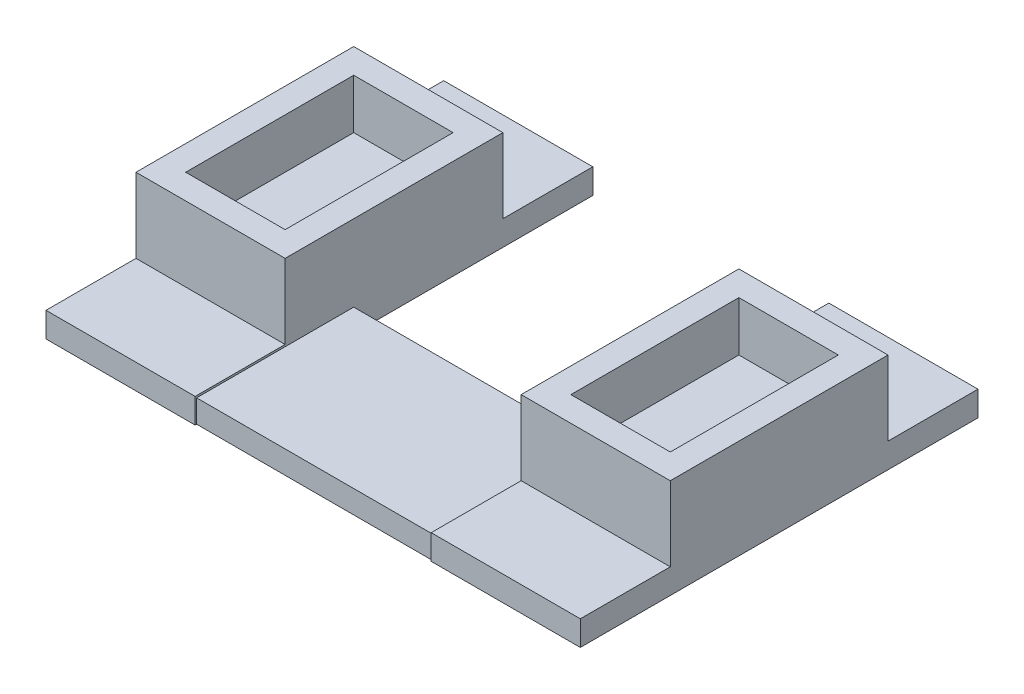
ISO-10303-21;
HEADER;
FILE_DESCRIPTION(('STEP AP214'),'2;1');
FILE_NAME('part.step','',(''),(''),'','','');
FILE_SCHEMA(('AUTOMOTIVE_DESIGN { 1 0 10303 214 1 1 1 1 }'));
ENDSEC;
DATA;
#1=APPLICATION_CONTEXT('core data for automotive mechanical design processes');
#2=APPLICATION_PROTOCOL_DEFINITION('international standard','automotive_design',2000,#1);
#3=PRODUCT_CONTEXT('',#1,'mechanical');
#4=PRODUCT('Part','Part','',(#3));
#5=PRODUCT_RELATED_PRODUCT_CATEGORY('part','',(#4));
#6=PRODUCT_DEFINITION_FORMATION('','',#4);
#7=PRODUCT_DEFINITION_CONTEXT('part definition',#1,'design');
#8=PRODUCT_DEFINITION('design','',#6,#7);
#9=PRODUCT_DEFINITION_SHAPE('','',#8);
#10=(LENGTH_UNIT() NAMED_UNIT(*) SI_UNIT(.MILLI.,.METRE.));
#11=(NAMED_UNIT(*) PLANE_ANGLE_UNIT() SI_UNIT($,.RADIAN.));
#12=(NAMED_UNIT(*) SI_UNIT($,.STERADIAN.) SOLID_ANGLE_UNIT());
#13=UNCERTAINTY_MEASURE_WITH_UNIT(LENGTH_MEASURE(1.E-05),#10,'distance_accuracy_value','');
#14=(GEOMETRIC_REPRESENTATION_CONTEXT(3) GLOBAL_UNCERTAINTY_ASSIGNED_CONTEXT((#13)) GLOBAL_UNIT_ASSIGNED_CONTEXT((#10,
#11,#12)) REPRESENTATION_CONTEXT('',''));
#15=CARTESIAN_POINT('',(0.,0.,0.));
#16=DIRECTION('',(0.,0.,1.));
#17=DIRECTION('',(1.,0.,0.));
#18=AXIS2_PLACEMENT_3D('',#15,#16,#17);
#19=CARTESIAN_POINT('',(15.0749,6.35,-13.9065));
#20=DIRECTION('',(1.,0.,0.));
#21=DIRECTION('',(0.,0.,-1.));
#22=AXIS2_PLACEMENT_3D('',#19,#20,#21);
#23=PLANE('',#22);
#24=DIRECTION('',(0.,0.,-1.));
#25=VECTOR('',#24,1.);
#26=CARTESIAN_POINT('',(15.0749,-3.42900000000001,13.9065));
#27=LINE('',#26,#25);
#28=CARTESIAN_POINT('',(15.0749,-3.42900000000001,25.2095));
#29=VERTEX_POINT('',#28);
#30=CARTESIAN_POINT('',(15.0749,-3.42900000000001,5.1435));
#31=VERTEX_POINT('',#30);
#32=EDGE_CURVE('E231',#29,#31,#27,.T.);
#33=ORIENTED_EDGE('',*,*,#32,.F.);
#34=DIRECTION('',(0.,1.,0.));
#35=VECTOR('',#34,1.);
#36=CARTESIAN_POINT('',(15.0749,-6.35,25.2095));
#37=LINE('',#36,#35);
#38=CARTESIAN_POINT('',(15.0749,-6.35,25.2095));
#39=VERTEX_POINT('',#38);
#40=EDGE_CURVE('E245',#39,#29,#37,.T.);
#41=ORIENTED_EDGE('',*,*,#40,.F.);
#42=DIRECTION('',(0.,0.,-1.));
#43=VECTOR('',#42,1.);
#44=CARTESIAN_POINT('',(15.0749,-6.35,13.9065));
#45=LINE('',#44,#43);
#46=CARTESIAN_POINT('',(15.0749,-6.35,25.4));
#47=VERTEX_POINT('',#46);
#48=EDGE_CURVE('E278',#47,#39,#45,.T.);
#49=ORIENTED_EDGE('',*,*,#48,.F.);
#50=DIRECTION('',(0.,1.,0.));
#51=VECTOR('',#50,1.);
#52=CARTESIAN_POINT('',(15.0749,-6.35,25.4));
#53=LINE('',#52,#51);
#54=CARTESIAN_POINT('',(15.0749,-3.175,25.4));
#55=VERTEX_POINT('',#54);
#56=EDGE_CURVE('E316',#47,#55,#53,.T.);
#57=ORIENTED_EDGE('',*,*,#56,.T.);
#58=DIRECTION('',(0.,0.,-1.));
#59=VECTOR('',#58,1.);
#60=CARTESIAN_POINT('',(15.0749,-3.175,13.9065));
#61=LINE('',#60,#59);
#62=CARTESIAN_POINT('',(15.0749,-3.175,13.9065));
#63=VERTEX_POINT('',#62);
#64=EDGE_CURVE('E303',#55,#63,#61,.T.);
#65=ORIENTED_EDGE('',*,*,#64,.T.);
#66=DIRECTION('',(0.,1.,0.));
#67=VECTOR('',#66,1.);
#68=CARTESIAN_POINT('',(15.0749,-3.42900000000001,13.9065));
#69=LINE('',#68,#67);
#70=CARTESIAN_POINT('',(15.0749,6.35,13.9065));
#71=VERTEX_POINT('',#70);
#72=EDGE_CURVE('E53',#63,#71,#69,.T.);
#73=ORIENTED_EDGE('',*,*,#72,.T.);
#74=DIRECTION('',(0.,0.,1.));
#75=VECTOR('',#74,1.);
#76=CARTESIAN_POINT('',(15.0749,6.35,-13.9065));
#77=LINE('',#76,#75);
#78=CARTESIAN_POINT('',(15.0749,6.35,-13.9065));
#79=VERTEX_POINT('',#78);
#80=EDGE_CURVE('E410',#79,#71,#77,.T.);
#81=ORIENTED_EDGE('',*,*,#80,.F.);
#82=DIRECTION('',(0.,-1.,0.));
#83=VECTOR('',#82,1.);
#84=CARTESIAN_POINT('',(15.0749,6.35,-13.9065));
#85=LINE('',#84,#83);
#86=CARTESIAN_POINT('',(15.0749,-3.175,-13.9065));
#87=VERTEX_POINT('',#86);
#88=EDGE_CURVE('E11',#79,#87,#85,.T.);
#89=ORIENTED_EDGE('',*,*,#88,.T.);
#90=DIRECTION('',(0.,0.,-1.));
#91=VECTOR('',#90,1.);
#92=CARTESIAN_POINT('',(15.0749,-3.175,-25.4));
#93=LINE('',#92,#91);
#94=CARTESIAN_POINT('',(15.0749,-3.175,-25.4));
#95=VERTEX_POINT('',#94);
#96=EDGE_CURVE('E293',#87,#95,#93,.T.);
#97=ORIENTED_EDGE('',*,*,#96,.T.);
#98=DIRECTION('',(0.,1.,0.));
#99=VECTOR('',#98,1.);
#100=CARTESIAN_POINT('',(15.0749,-6.35,-25.4));
#101=LINE('',#100,#99);
#102=CARTESIAN_POINT('',(15.0749,-6.35,-25.4));
#103=VERTEX_POINT('',#102);
#104=EDGE_CURVE('E324',#103,#95,#101,.T.);
#105=ORIENTED_EDGE('',*,*,#104,.F.);
#106=DIRECTION('',(0.,0.,-1.));
#107=VECTOR('',#106,1.);
#108=CARTESIAN_POINT('',(15.0749,-6.35,-25.4));
#109=LINE('',#108,#107);
#110=CARTESIAN_POINT('',(15.0749,-6.35,5.1435));
#111=VERTEX_POINT('',#110);
#112=EDGE_CURVE('E275',#111,#103,#109,.T.);
#113=ORIENTED_EDGE('',*,*,#112,.F.);
#114=DIRECTION('',(0.,-1.,0.));
#115=VECTOR('',#114,1.);
#116=CARTESIAN_POINT('',(15.0749,6.35,5.1435));
#117=LINE('',#116,#115);
#118=EDGE_CURVE('E50',#31,#111,#117,.T.);
#119=ORIENTED_EDGE('',*,*,#118,.F.);
#120=EDGE_LOOP('',(#33,#41,#49,#57,#65,#73,#81,#89,#97,#105,#113,#119));
#121=FACE_BOUND('',#120,.T.);
#122=ADVANCED_FACE('F39',(#121),#23,.F.);
#123=CARTESIAN_POINT('',(-15.0749,6.35,-13.9065));
#124=DIRECTION('',(-1.,0.,0.));
#125=DIRECTION('',(0.,0.,1.));
#126=AXIS2_PLACEMENT_3D('',#123,#124,#125);
#127=PLANE('',#126);
#128=DIRECTION('',(0.,-1.,0.));
#129=VECTOR('',#128,1.);
#130=CARTESIAN_POINT('',(-15.0749,-3.42900000000001,25.2095));
#131=LINE('',#130,#129);
#132=CARTESIAN_POINT('',(-15.0749,-3.42900000000001,25.2095));
#133=VERTEX_POINT('',#132);
#134=CARTESIAN_POINT('',(-15.0749,-6.35,25.2095));
#135=VERTEX_POINT('',#134);
#136=EDGE_CURVE('E239',#133,#135,#131,.T.);
#137=ORIENTED_EDGE('',*,*,#136,.F.);
#138=DIRECTION('',(0.,0.,1.));
#139=VECTOR('',#138,1.);
#140=CARTESIAN_POINT('',(-15.0749,-3.42900000000001,5.1435));
#141=LINE('',#140,#139);
#142=CARTESIAN_POINT('',(-15.0749,-3.42900000000001,5.1435));
#143=VERTEX_POINT('',#142);
#144=EDGE_CURVE('E223',#143,#133,#141,.T.);
#145=ORIENTED_EDGE('',*,*,#144,.F.);
#146=DIRECTION('',(0.,-1.,0.));
#147=VECTOR('',#146,1.);
#148=CARTESIAN_POINT('',(-15.0749,6.35,5.1435));
#149=LINE('',#148,#147);
#150=CARTESIAN_POINT('',(-15.0749,-6.35,5.1435));
#151=VERTEX_POINT('',#150);
#152=EDGE_CURVE('E431',#143,#151,#149,.T.);
#153=ORIENTED_EDGE('',*,*,#152,.T.);
#154=DIRECTION('',(0.,0.,1.));
#155=VECTOR('',#154,1.);
#156=CARTESIAN_POINT('',(-15.0749,-6.35,-25.4));
#157=LINE('',#156,#155);
#158=CARTESIAN_POINT('',(-15.0749,-6.35,-25.4));
#159=VERTEX_POINT('',#158);
#160=EDGE_CURVE('E266',#159,#151,#157,.T.);
#161=ORIENTED_EDGE('',*,*,#160,.F.);
#162=DIRECTION('',(0.,1.,0.));
#163=VECTOR('',#162,1.);
#164=CARTESIAN_POINT('',(-15.0749,-6.35,-25.4));
#165=LINE('',#164,#163);
#166=CARTESIAN_POINT('',(-15.0749,-3.175,-25.4));
#167=VERTEX_POINT('',#166);
#168=EDGE_CURVE('E327',#159,#167,#165,.T.);
#169=ORIENTED_EDGE('',*,*,#168,.T.);
#170=DIRECTION('',(0.,0.,1.));
#171=VECTOR('',#170,1.);
#172=CARTESIAN_POINT('',(-15.0749,-3.175,-25.4));
#173=LINE('',#172,#171);
#174=CARTESIAN_POINT('',(-15.0749,-3.175,-13.9065));
#175=VERTEX_POINT('',#174);
#176=EDGE_CURVE('E295',#167,#175,#173,.T.);
#177=ORIENTED_EDGE('',*,*,#176,.T.);
#178=DIRECTION('',(0.,-1.,0.));
#179=VECTOR('',#178,1.);
#180=CARTESIAN_POINT('',(-15.0749,6.35,-13.9065));
#181=LINE('',#180,#179);
#182=CARTESIAN_POINT('',(-15.0749,6.35,-13.9065));
#183=VERTEX_POINT('',#182);
#184=EDGE_CURVE('E427',#183,#175,#181,.T.);
#185=ORIENTED_EDGE('',*,*,#184,.F.);
#186=DIRECTION('',(0.,0.,-1.));
#187=VECTOR('',#186,1.);
#188=CARTESIAN_POINT('',(-15.0749,6.35,-13.9065));
#189=LINE('',#188,#187);
#190=CARTESIAN_POINT('',(-15.0749,6.35,13.9065));
#191=VERTEX_POINT('',#190);
#192=EDGE_CURVE('E406',#191,#183,#189,.T.);
#193=ORIENTED_EDGE('',*,*,#192,.F.);
#194=DIRECTION('',(0.,1.,0.));
#195=VECTOR('',#194,1.);
#196=CARTESIAN_POINT('',(-15.0749,-3.42900000000001,13.9065));
#197=LINE('',#196,#195);
#198=CARTESIAN_POINT('',(-15.0749,-3.175,13.9065));
#199=VERTEX_POINT('',#198);
#200=EDGE_CURVE('E254',#199,#191,#197,.T.);
#201=ORIENTED_EDGE('',*,*,#200,.F.);
#202=DIRECTION('',(0.,0.,1.));
#203=VECTOR('',#202,1.);
#204=CARTESIAN_POINT('',(-15.0749,-3.175,13.9065));
#205=LINE('',#204,#203);
#206=CARTESIAN_POINT('',(-15.0749,-3.175,25.4));
#207=VERTEX_POINT('',#206);
#208=EDGE_CURVE('E306',#199,#207,#205,.T.);
#209=ORIENTED_EDGE('',*,*,#208,.T.);
#210=DIRECTION('',(0.,1.,0.));
#211=VECTOR('',#210,1.);
#212=CARTESIAN_POINT('',(-15.0749,-6.35,25.4));
#213=LINE('',#212,#211);
#214=CARTESIAN_POINT('',(-15.0749,-6.35,25.4));
#215=VERTEX_POINT('',#214);
#216=EDGE_CURVE('E311',#215,#207,#213,.T.);
#217=ORIENTED_EDGE('',*,*,#216,.F.);
#218=DIRECTION('',(0.,0.,1.));
#219=VECTOR('',#218,1.);
#220=CARTESIAN_POINT('',(-15.0749,-6.35,13.9065));
#221=LINE('',#220,#219);
#222=EDGE_CURVE('E249',#135,#215,#221,.T.);
#223=ORIENTED_EDGE('',*,*,#222,.F.);
#224=EDGE_LOOP('',(#137,#145,#153,#161,#169,#177,#185,#193,#201,#209,#217,#223));
#225=FACE_BOUND('',#224,.T.);
#226=ADVANCED_FACE('F243',(#225),#127,.F.);
#227=CARTESIAN_POINT('',(0.,6.35,0.));
#228=DIRECTION('',(0.,-1.,0.));
#229=DIRECTION('',(0.,0.,-1.));
#230=AXIS2_PLACEMENT_3D('',#227,#228,#229);
#231=PLANE('',#230);
#232=DIRECTION('',(0.,0.,-1.));
#233=VECTOR('',#232,1.);
#234=CARTESIAN_POINT('',(-18.2499,6.35,-10.7315));
#235=LINE('',#234,#233);
#236=CARTESIAN_POINT('',(-18.2499,6.35,10.7315));
#237=VERTEX_POINT('',#236);
#238=CARTESIAN_POINT('',(-18.2499,6.35,-10.7315));
#239=VERTEX_POINT('',#238);
#240=EDGE_CURVE('E373',#237,#239,#235,.T.);
#241=ORIENTED_EDGE('',*,*,#240,.F.);
#242=DIRECTION('',(1.,0.,0.));
#243=VECTOR('',#242,1.);
#244=CARTESIAN_POINT('',(-30.9499,6.35,10.7315));
#245=LINE('',#244,#243);
#246=CARTESIAN_POINT('',(-30.9499,6.35,10.7315));
#247=VERTEX_POINT('',#246);
#248=EDGE_CURVE('E381',#247,#237,#245,.T.);
#249=ORIENTED_EDGE('',*,*,#248,.F.);
#250=DIRECTION('',(0.,0.,1.));
#251=VECTOR('',#250,1.);
#252=CARTESIAN_POINT('',(-30.9499,6.35,-10.7315));
#253=LINE('',#252,#251);
#254=CARTESIAN_POINT('',(-30.9499,6.35,-10.7315));
#255=VERTEX_POINT('',#254);
#256=EDGE_CURVE('E378',#255,#247,#253,.T.);
#257=ORIENTED_EDGE('',*,*,#256,.F.);
#258=DIRECTION('',(-1.,0.,0.));
#259=VECTOR('',#258,1.);
#260=CARTESIAN_POINT('',(-30.9499,6.35,-10.7315));
#261=LINE('',#260,#259);
#262=EDGE_CURVE('E374',#239,#255,#261,.T.);
#263=ORIENTED_EDGE('',*,*,#262,.F.);
#264=EDGE_LOOP('',(#241,#249,#257,#263));
#265=FACE_BOUND('',#264,.T.);
#266=DIRECTION('',(1.,0.,0.));
#267=VECTOR('',#266,1.);
#268=CARTESIAN_POINT('',(-34.1249,6.35,13.9065));
#269=LINE('',#268,#267);
#270=CARTESIAN_POINT('',(-34.1249,6.35,13.9065));
#271=VERTEX_POINT('',#270);
#272=EDGE_CURVE('E418',#271,#191,#269,.T.);
#273=ORIENTED_EDGE('',*,*,#272,.T.);
#274=ORIENTED_EDGE('',*,*,#192,.T.);
#275=DIRECTION('',(-1.,0.,0.));
#276=VECTOR('',#275,1.);
#277=CARTESIAN_POINT('',(-34.1249,6.35,-13.9065));
#278=LINE('',#277,#276);
#279=CARTESIAN_POINT('',(-34.1249,6.35,-13.9065));
#280=VERTEX_POINT('',#279);
#281=EDGE_CURVE('E412',#183,#280,#278,.T.);
#282=ORIENTED_EDGE('',*,*,#281,.T.);
#283=DIRECTION('',(0.,0.,1.));
#284=VECTOR('',#283,1.);
#285=CARTESIAN_POINT('',(-34.1249,6.35,-13.9065));
#286=LINE('',#285,#284);
#287=EDGE_CURVE('E415',#280,#271,#286,.T.);
#288=ORIENTED_EDGE('',*,*,#287,.T.);
#289=EDGE_LOOP('',(#273,#274,#282,#288));
#290=FACE_BOUND('',#289,.T.);
#291=ADVANCED_FACE('F495',(#265,#290),#231,.F.);
#292=DIRECTION('',(-1.,0.,0.));
#293=VECTOR('',#292,1.);
#294=CARTESIAN_POINT('',(18.2499,6.35,-10.7315));
#295=LINE('',#294,#293);
#296=CARTESIAN_POINT('',(30.9499,6.35,-10.7315));
#297=VERTEX_POINT('',#296);
#298=CARTESIAN_POINT('',(18.2499,6.35,-10.7315));
#299=VERTEX_POINT('',#298);
#300=EDGE_CURVE('E341',#297,#299,#295,.T.);
#301=ORIENTED_EDGE('',*,*,#300,.F.);
#302=DIRECTION('',(0.,0.,-1.));
#303=VECTOR('',#302,1.);
#304=CARTESIAN_POINT('',(30.9499,6.35,-10.7315));
#305=LINE('',#304,#303);
#306=CARTESIAN_POINT('',(30.9499,6.35,10.7315));
#307=VERTEX_POINT('',#306);
#308=EDGE_CURVE('E352',#307,#297,#305,.T.);
#309=ORIENTED_EDGE('',*,*,#308,.F.);
#310=DIRECTION('',(1.,0.,0.));
#311=VECTOR('',#310,1.);
#312=CARTESIAN_POINT('',(18.2499,6.35,10.7315));
#313=LINE('',#312,#311);
#314=CARTESIAN_POINT('',(18.2499,6.35,10.7315));
#315=VERTEX_POINT('',#314);
#316=EDGE_CURVE('E349',#315,#307,#313,.T.);
#317=ORIENTED_EDGE('',*,*,#316,.F.);
#318=DIRECTION('',(0.,0.,1.));
#319=VECTOR('',#318,1.);
#320=CARTESIAN_POINT('',(18.2499,6.35,-10.7315));
#321=LINE('',#320,#319);
#322=EDGE_CURVE('E347',#299,#315,#321,.T.);
#323=ORIENTED_EDGE('',*,*,#322,.F.);
#324=EDGE_LOOP('',(#301,#309,#317,#323));
#325=FACE_BOUND('',#324,.T.);
#326=ORIENTED_EDGE('',*,*,#80,.T.);
#327=CARTESIAN_POINT('',(34.1249,6.35,13.9065));
#328=VERTEX_POINT('',#327);
#329=EDGE_CURVE('E413',#71,#328,#269,.T.);
#330=ORIENTED_EDGE('',*,*,#329,.T.);
#331=DIRECTION('',(0.,0.,-1.));
#332=VECTOR('',#331,1.);
#333=CARTESIAN_POINT('',(34.1249,6.35,-13.9065));
#334=LINE('',#333,#332);
#335=CARTESIAN_POINT('',(34.1249,6.35,-13.9065));
#336=VERTEX_POINT('',#335);
#337=EDGE_CURVE('E420',#328,#336,#334,.T.);
#338=ORIENTED_EDGE('',*,*,#337,.T.);
#339=DIRECTION('',(-1.,0.,0.));
#340=VECTOR('',#339,1.);
#341=CARTESIAN_POINT('',(15.0749,6.35,-13.9065));
#342=LINE('',#341,#340);
#343=EDGE_CURVE('E404',#336,#79,#342,.T.);
#344=ORIENTED_EDGE('',*,*,#343,.T.);
#345=EDGE_LOOP('',(#326,#330,#338,#344));
#346=FACE_BOUND('',#345,.T.);
#347=ADVANCED_FACE('F513',(#325,#346),#231,.F.);
#348=CARTESIAN_POINT('',(-15.0749,6.35,5.1435));
#349=DIRECTION('',(0.,0.,1.));
#350=DIRECTION('',(1.,0.,0.));
#351=AXIS2_PLACEMENT_3D('',#348,#349,#350);
#352=PLANE('',#351);
#353=DIRECTION('',(-1.,0.,0.));
#354=VECTOR('',#353,1.);
#355=CARTESIAN_POINT('',(15.0749,-3.42900000000001,5.1435));
#356=LINE('',#355,#354);
#357=EDGE_CURVE('E228',#31,#143,#356,.T.);
#358=ORIENTED_EDGE('',*,*,#357,.F.);
#359=ORIENTED_EDGE('',*,*,#118,.T.);
#360=DIRECTION('',(1.,0.,0.));
#361=VECTOR('',#360,1.);
#362=CARTESIAN_POINT('',(-15.0749,-6.35,5.1435));
#363=LINE('',#362,#361);
#364=EDGE_CURVE('E267',#151,#111,#363,.T.);
#365=ORIENTED_EDGE('',*,*,#364,.F.);
#366=ORIENTED_EDGE('',*,*,#152,.F.);
#367=EDGE_LOOP('',(#358,#359,#365,#366));
#368=FACE_BOUND('',#367,.T.);
#369=ADVANCED_FACE('F434',(#368),#352,.F.);
#370=CARTESIAN_POINT('',(15.0749,6.35,13.9065));
#371=DIRECTION('',(0.,0.,-1.));
#372=DIRECTION('',(-1.,0.,0.));
#373=AXIS2_PLACEMENT_3D('',#370,#371,#372);
#374=PLANE('',#373);
#375=ORIENTED_EDGE('',*,*,#72,.F.);
#376=DIRECTION('',(-1.,0.,0.));
#377=VECTOR('',#376,1.);
#378=CARTESIAN_POINT('',(-34.1249,-3.175,13.9065));
#379=LINE('',#378,#377);
#380=CARTESIAN_POINT('',(34.1249,-3.175,13.9065));
#381=VERTEX_POINT('',#380);
#382=EDGE_CURVE('E339',#381,#63,#379,.T.);
#383=ORIENTED_EDGE('',*,*,#382,.F.);
#384=DIRECTION('',(0.,-1.,0.));
#385=VECTOR('',#384,1.);
#386=CARTESIAN_POINT('',(34.1249,6.35,13.9065));
#387=LINE('',#386,#385);
#388=EDGE_CURVE('E421',#328,#381,#387,.T.);
#389=ORIENTED_EDGE('',*,*,#388,.F.);
#390=ORIENTED_EDGE('',*,*,#329,.F.);
#391=EDGE_LOOP('',(#375,#383,#389,#390));
#392=FACE_BOUND('',#391,.T.);
#393=ADVANCED_FACE('F514',(#392),#374,.F.);
#394=CARTESIAN_POINT('',(15.0749,6.35,-13.9065));
#395=DIRECTION('',(0.,0.,1.));
#396=DIRECTION('',(1.,0.,0.));
#397=AXIS2_PLACEMENT_3D('',#394,#395,#396);
#398=PLANE('',#397);
#399=DIRECTION('',(0.,-1.,0.));
#400=VECTOR('',#399,1.);
#401=CARTESIAN_POINT('',(34.1249,6.35,-13.9065));
#402=LINE('',#401,#400);
#403=CARTESIAN_POINT('',(34.1249,-3.175,-13.9065));
#404=VERTEX_POINT('',#403);
#405=EDGE_CURVE('E423',#336,#404,#402,.T.);
#406=ORIENTED_EDGE('',*,*,#405,.T.);
#407=DIRECTION('',(1.,0.,0.));
#408=VECTOR('',#407,1.);
#409=CARTESIAN_POINT('',(34.1249,-3.175,-13.9065));
#410=LINE('',#409,#408);
#411=EDGE_CURVE('E331',#87,#404,#410,.T.);
#412=ORIENTED_EDGE('',*,*,#411,.F.);
#413=ORIENTED_EDGE('',*,*,#88,.F.);
#414=ORIENTED_EDGE('',*,*,#343,.F.);
#415=EDGE_LOOP('',(#406,#412,#413,#414));
#416=FACE_BOUND('',#415,.T.);
#417=ADVANCED_FACE('F41',(#416),#398,.F.);
#418=CARTESIAN_POINT('',(-34.1249,6.35,-13.9065));
#419=DIRECTION('',(0.,0.,1.));
#420=DIRECTION('',(1.,0.,0.));
#421=AXIS2_PLACEMENT_3D('',#418,#419,#420);
#422=PLANE('',#421);
#423=ORIENTED_EDGE('',*,*,#184,.T.);
#424=DIRECTION('',(1.,0.,0.));
#425=VECTOR('',#424,1.);
#426=CARTESIAN_POINT('',(-15.0749,-3.175,-13.9065));
#427=LINE('',#426,#425);
#428=CARTESIAN_POINT('',(-34.1249,-3.175,-13.9065));
#429=VERTEX_POINT('',#428);
#430=EDGE_CURVE('E338',#429,#175,#427,.T.);
#431=ORIENTED_EDGE('',*,*,#430,.F.);
#432=DIRECTION('',(0.,-1.,0.));
#433=VECTOR('',#432,1.);
#434=CARTESIAN_POINT('',(-34.1249,6.35,-13.9065));
#435=LINE('',#434,#433);
#436=EDGE_CURVE('E430',#280,#429,#435,.T.);
#437=ORIENTED_EDGE('',*,*,#436,.F.);
#438=ORIENTED_EDGE('',*,*,#281,.F.);
#439=EDGE_LOOP('',(#423,#431,#437,#438));
#440=FACE_BOUND('',#439,.T.);
#441=ADVANCED_FACE('F483',(#440),#422,.F.);
#442=CARTESIAN_POINT('',(-34.1249,6.35,-13.9065));
#443=DIRECTION('',(1.,0.,0.));
#444=DIRECTION('',(0.,0.,-1.));
#445=AXIS2_PLACEMENT_3D('',#442,#443,#444);
#446=PLANE('',#445);
#447=ORIENTED_EDGE('',*,*,#436,.T.);
#448=DIRECTION('',(0.,0.,-1.));
#449=VECTOR('',#448,1.);
#450=CARTESIAN_POINT('',(-34.1249,-3.175,25.4));
#451=LINE('',#450,#449);
#452=CARTESIAN_POINT('',(-34.1249,-3.175,-25.4));
#453=VERTEX_POINT('',#452);
#454=EDGE_CURVE('E260',#429,#453,#451,.T.);
#455=ORIENTED_EDGE('',*,*,#454,.T.);
#456=DIRECTION('',(0.,1.,0.));
#457=VECTOR('',#456,1.);
#458=CARTESIAN_POINT('',(-34.1249,-6.35,-25.4));
#459=LINE('',#458,#457);
#460=CARTESIAN_POINT('',(-34.1249,-6.35,-25.4));
#461=VERTEX_POINT('',#460);
#462=EDGE_CURVE('E332',#461,#453,#459,.T.);
#463=ORIENTED_EDGE('',*,*,#462,.F.);
#464=DIRECTION('',(0.,0.,-1.));
#465=VECTOR('',#464,1.);
#466=CARTESIAN_POINT('',(-34.1249,-6.35,25.4));
#467=LINE('',#466,#465);
#468=CARTESIAN_POINT('',(-34.1249,-6.35,25.4));
#469=VERTEX_POINT('',#468);
#470=EDGE_CURVE('E257',#469,#461,#467,.T.);
#471=ORIENTED_EDGE('',*,*,#470,.F.);
#472=DIRECTION('',(0.,1.,0.));
#473=VECTOR('',#472,1.);
#474=CARTESIAN_POINT('',(-34.1249,-6.35,25.4));
#475=LINE('',#474,#473);
#476=CARTESIAN_POINT('',(-34.1249,-3.175,25.4));
#477=VERTEX_POINT('',#476);
#478=EDGE_CURVE('E287',#469,#477,#475,.T.);
#479=ORIENTED_EDGE('',*,*,#478,.T.);
#480=CARTESIAN_POINT('',(-34.1249,-3.175,13.9065));
#481=VERTEX_POINT('',#480);
#482=EDGE_CURVE('E289',#477,#481,#451,.T.);
#483=ORIENTED_EDGE('',*,*,#482,.T.);
#484=DIRECTION('',(0.,-1.,0.));
#485=VECTOR('',#484,1.);
#486=CARTESIAN_POINT('',(-34.1249,6.35,13.9065));
#487=LINE('',#486,#485);
#488=EDGE_CURVE('E422',#271,#481,#487,.T.);
#489=ORIENTED_EDGE('',*,*,#488,.F.);
#490=ORIENTED_EDGE('',*,*,#287,.F.);
#491=EDGE_LOOP('',(#447,#455,#463,#471,#479,#483,#489,#490));
#492=FACE_BOUND('',#491,.T.);
#493=ADVANCED_FACE('F468',(#492),#446,.F.);
#494=EDGE_CURVE('E340',#199,#481,#379,.T.);
#495=ORIENTED_EDGE('',*,*,#494,.F.);
#496=ORIENTED_EDGE('',*,*,#200,.T.);
#497=ORIENTED_EDGE('',*,*,#272,.F.);
#498=ORIENTED_EDGE('',*,*,#488,.T.);
#499=EDGE_LOOP('',(#495,#496,#497,#498));
#500=FACE_BOUND('',#499,.T.);
#501=ADVANCED_FACE('F489',(#500),#374,.F.);
#502=CARTESIAN_POINT('',(34.1249,6.35,-13.9065));
#503=DIRECTION('',(-1.,0.,0.));
#504=DIRECTION('',(0.,0.,1.));
#505=AXIS2_PLACEMENT_3D('',#502,#503,#504);
#506=PLANE('',#505);
#507=ORIENTED_EDGE('',*,*,#388,.T.);
#508=DIRECTION('',(0.,0.,1.));
#509=VECTOR('',#508,1.);
#510=CARTESIAN_POINT('',(34.1249,-3.175,25.4));
#511=LINE('',#510,#509);
#512=CARTESIAN_POINT('',(34.1249,-3.175,25.4));
#513=VERTEX_POINT('',#512);
#514=EDGE_CURVE('E296',#381,#513,#511,.T.);
#515=ORIENTED_EDGE('',*,*,#514,.T.);
#516=DIRECTION('',(0.,1.,0.));
#517=VECTOR('',#516,1.);
#518=CARTESIAN_POINT('',(34.1249,-6.35,25.4));
#519=LINE('',#518,#517);
#520=CARTESIAN_POINT('',(34.1249,-6.35,25.4));
#521=VERTEX_POINT('',#520);
#522=EDGE_CURVE('E317',#521,#513,#519,.T.);
#523=ORIENTED_EDGE('',*,*,#522,.F.);
#524=DIRECTION('',(0.,0.,1.));
#525=VECTOR('',#524,1.);
#526=CARTESIAN_POINT('',(34.1249,-6.35,25.4));
#527=LINE('',#526,#525);
#528=CARTESIAN_POINT('',(34.1249,-6.35,-25.4));
#529=VERTEX_POINT('',#528);
#530=EDGE_CURVE('E277',#529,#521,#527,.T.);
#531=ORIENTED_EDGE('',*,*,#530,.F.);
#532=DIRECTION('',(0.,1.,0.));
#533=VECTOR('',#532,1.);
#534=CARTESIAN_POINT('',(34.1249,-6.35,-25.4));
#535=LINE('',#534,#533);
#536=CARTESIAN_POINT('',(34.1249,-3.175,-25.4));
#537=VERTEX_POINT('',#536);
#538=EDGE_CURVE('E325',#529,#537,#535,.T.);
#539=ORIENTED_EDGE('',*,*,#538,.T.);
#540=EDGE_CURVE('E298',#537,#404,#511,.T.);
#541=ORIENTED_EDGE('',*,*,#540,.T.);
#542=ORIENTED_EDGE('',*,*,#405,.F.);
#543=ORIENTED_EDGE('',*,*,#337,.F.);
#544=EDGE_LOOP('',(#507,#515,#523,#531,#539,#541,#542,#543));
#545=FACE_BOUND('',#544,.T.);
#546=ADVANCED_FACE('F455',(#545),#506,.F.);
#547=CARTESIAN_POINT('',(-18.2499,6.35,-10.7315));
#548=DIRECTION('',(-1.,0.,0.));
#549=DIRECTION('',(0.,0.,1.));
#550=AXIS2_PLACEMENT_3D('',#547,#548,#549);
#551=PLANE('',#550);
#552=DIRECTION('',(0.,0.,-1.));
#553=VECTOR('',#552,1.);
#554=CARTESIAN_POINT('',(-18.2499,0.,-10.7315));
#555=LINE('',#554,#553);
#556=CARTESIAN_POINT('',(-18.2499,0.,10.7315));
#557=VERTEX_POINT('',#556);
#558=CARTESIAN_POINT('',(-18.2499,0.,-10.7315));
#559=VERTEX_POINT('',#558);
#560=EDGE_CURVE('E375',#557,#559,#555,.T.);
#561=ORIENTED_EDGE('',*,*,#560,.F.);
#562=DIRECTION('',(0.,-1.,0.));
#563=VECTOR('',#562,1.);
#564=CARTESIAN_POINT('',(-18.2499,6.35,10.7315));
#565=LINE('',#564,#563);
#566=EDGE_CURVE('E382',#237,#557,#565,.T.);
#567=ORIENTED_EDGE('',*,*,#566,.F.);
#568=ORIENTED_EDGE('',*,*,#240,.T.);
#569=DIRECTION('',(0.,-1.,0.));
#570=VECTOR('',#569,1.);
#571=CARTESIAN_POINT('',(-18.2499,6.35,-10.7315));
#572=LINE('',#571,#570);
#573=EDGE_CURVE('E402',#239,#559,#572,.T.);
#574=ORIENTED_EDGE('',*,*,#573,.T.);
#575=EDGE_LOOP('',(#561,#567,#568,#574));
#576=FACE_BOUND('',#575,.T.);
#577=ADVANCED_FACE('F523',(#576),#551,.T.);
#578=CARTESIAN_POINT('',(-30.9499,6.35,-10.7315));
#579=DIRECTION('',(0.,0.,1.));
#580=DIRECTION('',(1.,0.,0.));
#581=AXIS2_PLACEMENT_3D('',#578,#579,#580);
#582=PLANE('',#581);
#583=DIRECTION('',(-1.,0.,0.));
#584=VECTOR('',#583,1.);
#585=CARTESIAN_POINT('',(-30.9499,0.,-10.7315));
#586=LINE('',#585,#584);
#587=CARTESIAN_POINT('',(-30.9499,0.,-10.7315));
#588=VERTEX_POINT('',#587);
#589=EDGE_CURVE('E387',#559,#588,#586,.T.);
#590=ORIENTED_EDGE('',*,*,#589,.F.);
#591=ORIENTED_EDGE('',*,*,#573,.F.);
#592=ORIENTED_EDGE('',*,*,#262,.T.);
#593=DIRECTION('',(0.,-1.,0.));
#594=VECTOR('',#593,1.);
#595=CARTESIAN_POINT('',(-30.9499,6.35,-10.7315));
#596=LINE('',#595,#594);
#597=EDGE_CURVE('E396',#255,#588,#596,.T.);
#598=ORIENTED_EDGE('',*,*,#597,.T.);
#599=EDGE_LOOP('',(#590,#591,#592,#598));
#600=FACE_BOUND('',#599,.T.);
#601=ADVANCED_FACE('F533',(#600),#582,.T.);
#602=CARTESIAN_POINT('',(-30.9499,6.35,-10.7315));
#603=DIRECTION('',(1.,0.,0.));
#604=DIRECTION('',(0.,0.,-1.));
#605=AXIS2_PLACEMENT_3D('',#602,#603,#604);
#606=PLANE('',#605);
#607=DIRECTION('',(0.,0.,1.));
#608=VECTOR('',#607,1.);
#609=CARTESIAN_POINT('',(-30.9499,0.,-10.7315));
#610=LINE('',#609,#608);
#611=CARTESIAN_POINT('',(-30.9499,0.,10.7315));
#612=VERTEX_POINT('',#611);
#613=EDGE_CURVE('E386',#588,#612,#610,.T.);
#614=ORIENTED_EDGE('',*,*,#613,.F.);
#615=ORIENTED_EDGE('',*,*,#597,.F.);
#616=ORIENTED_EDGE('',*,*,#256,.T.);
#617=DIRECTION('',(0.,-1.,0.));
#618=VECTOR('',#617,1.);
#619=CARTESIAN_POINT('',(-30.9499,6.35,10.7315));
#620=LINE('',#619,#618);
#621=EDGE_CURVE('E397',#247,#612,#620,.T.);
#622=ORIENTED_EDGE('',*,*,#621,.T.);
#623=EDGE_LOOP('',(#614,#615,#616,#622));
#624=FACE_BOUND('',#623,.T.);
#625=ADVANCED_FACE('F532',(#624),#606,.T.);
#626=CARTESIAN_POINT('',(-30.9499,6.35,10.7315));
#627=DIRECTION('',(0.,0.,-1.));
#628=DIRECTION('',(-1.,0.,0.));
#629=AXIS2_PLACEMENT_3D('',#626,#627,#628);
#630=PLANE('',#629);
#631=DIRECTION('',(1.,0.,0.));
#632=VECTOR('',#631,1.);
#633=CARTESIAN_POINT('',(-30.9499,0.,10.7315));
#634=LINE('',#633,#632);
#635=EDGE_CURVE('E376',#612,#557,#634,.T.);
#636=ORIENTED_EDGE('',*,*,#635,.F.);
#637=ORIENTED_EDGE('',*,*,#621,.F.);
#638=ORIENTED_EDGE('',*,*,#248,.T.);
#639=ORIENTED_EDGE('',*,*,#566,.T.);
#640=EDGE_LOOP('',(#636,#637,#638,#639));
#641=FACE_BOUND('',#640,.T.);
#642=ADVANCED_FACE('F537',(#641),#630,.T.);
#643=CARTESIAN_POINT('',(18.2499,6.35,-10.7315));
#644=DIRECTION('',(0.,0.,1.));
#645=DIRECTION('',(1.,0.,0.));
#646=AXIS2_PLACEMENT_3D('',#643,#644,#645);
#647=PLANE('',#646);
#648=DIRECTION('',(-1.,0.,0.));
#649=VECTOR('',#648,1.);
#650=CARTESIAN_POINT('',(18.2499,0.,-10.7315));
#651=LINE('',#650,#649);
#652=CARTESIAN_POINT('',(30.9499,0.,-10.7315));
#653=VERTEX_POINT('',#652);
#654=CARTESIAN_POINT('',(18.2499,0.,-10.7315));
#655=VERTEX_POINT('',#654);
#656=EDGE_CURVE('E345',#653,#655,#651,.T.);
#657=ORIENTED_EDGE('',*,*,#656,.F.);
#658=DIRECTION('',(0.,-1.,0.));
#659=VECTOR('',#658,1.);
#660=CARTESIAN_POINT('',(30.9499,6.35,-10.7315));
#661=LINE('',#660,#659);
#662=EDGE_CURVE('E354',#297,#653,#661,.T.);
#663=ORIENTED_EDGE('',*,*,#662,.F.);
#664=ORIENTED_EDGE('',*,*,#300,.T.);
#665=DIRECTION('',(0.,-1.,0.));
#666=VECTOR('',#665,1.);
#667=CARTESIAN_POINT('',(18.2499,6.35,-10.7315));
#668=LINE('',#667,#666);
#669=EDGE_CURVE('E369',#299,#655,#668,.T.);
#670=ORIENTED_EDGE('',*,*,#669,.T.);
#671=EDGE_LOOP('',(#657,#663,#664,#670));
#672=FACE_BOUND('',#671,.T.);
#673=ADVANCED_FACE('F543',(#672),#647,.T.);
#674=CARTESIAN_POINT('',(18.2499,6.35,-10.7315));
#675=DIRECTION('',(1.,0.,0.));
#676=DIRECTION('',(0.,0.,-1.));
#677=AXIS2_PLACEMENT_3D('',#674,#675,#676);
#678=PLANE('',#677);
#679=DIRECTION('',(0.,0.,1.));
#680=VECTOR('',#679,1.);
#681=CARTESIAN_POINT('',(18.2499,0.,-10.7315));
#682=LINE('',#681,#680);
#683=CARTESIAN_POINT('',(18.2499,0.,10.7315));
#684=VERTEX_POINT('',#683);
#685=EDGE_CURVE('E357',#655,#684,#682,.T.);
#686=ORIENTED_EDGE('',*,*,#685,.F.);
#687=ORIENTED_EDGE('',*,*,#669,.F.);
#688=ORIENTED_EDGE('',*,*,#322,.T.);
#689=DIRECTION('',(0.,-1.,0.));
#690=VECTOR('',#689,1.);
#691=CARTESIAN_POINT('',(18.2499,6.35,10.7315));
#692=LINE('',#691,#690);
#693=EDGE_CURVE('E370',#315,#684,#692,.T.);
#694=ORIENTED_EDGE('',*,*,#693,.T.);
#695=EDGE_LOOP('',(#686,#687,#688,#694));
#696=FACE_BOUND('',#695,.T.);
#697=ADVANCED_FACE('F550',(#696),#678,.T.);
#698=CARTESIAN_POINT('',(18.2499,6.35,10.7315));
#699=DIRECTION('',(0.,0.,-1.));
#700=DIRECTION('',(-1.,0.,0.));
#701=AXIS2_PLACEMENT_3D('',#698,#699,#700);
#702=PLANE('',#701);
#703=DIRECTION('',(1.,0.,0.));
#704=VECTOR('',#703,1.);
#705=CARTESIAN_POINT('',(18.2499,0.,10.7315));
#706=LINE('',#705,#704);
#707=CARTESIAN_POINT('',(30.9499,0.,10.7315));
#708=VERTEX_POINT('',#707);
#709=EDGE_CURVE('E356',#684,#708,#706,.T.);
#710=ORIENTED_EDGE('',*,*,#709,.F.);
#711=ORIENTED_EDGE('',*,*,#693,.F.);
#712=ORIENTED_EDGE('',*,*,#316,.T.);
#713=DIRECTION('',(0.,-1.,0.));
#714=VECTOR('',#713,1.);
#715=CARTESIAN_POINT('',(30.9499,6.35,10.7315));
#716=LINE('',#715,#714);
#717=EDGE_CURVE('E65',#307,#708,#716,.T.);
#718=ORIENTED_EDGE('',*,*,#717,.T.);
#719=EDGE_LOOP('',(#710,#711,#712,#718));
#720=FACE_BOUND('',#719,.T.);
#721=ADVANCED_FACE('F552',(#720),#702,.T.);
#722=CARTESIAN_POINT('',(30.9499,6.35,-10.7315));
#723=DIRECTION('',(-1.,0.,0.));
#724=DIRECTION('',(0.,0.,1.));
#725=AXIS2_PLACEMENT_3D('',#722,#723,#724);
#726=PLANE('',#725);
#727=DIRECTION('',(0.,0.,-1.));
#728=VECTOR('',#727,1.);
#729=CARTESIAN_POINT('',(30.9499,0.,-10.7315));
#730=LINE('',#729,#728);
#731=EDGE_CURVE('E350',#708,#653,#730,.T.);
#732=ORIENTED_EDGE('',*,*,#731,.F.);
#733=ORIENTED_EDGE('',*,*,#717,.F.);
#734=ORIENTED_EDGE('',*,*,#308,.T.);
#735=ORIENTED_EDGE('',*,*,#662,.T.);
#736=EDGE_LOOP('',(#732,#733,#734,#735));
#737=FACE_BOUND('',#736,.T.);
#738=ADVANCED_FACE('F553',(#737),#726,.T.);
#739=CARTESIAN_POINT('',(0.,0.,0.));
#740=DIRECTION('',(0.,-1.,0.));
#741=DIRECTION('',(0.,0.,-1.));
#742=AXIS2_PLACEMENT_3D('',#739,#740,#741);
#743=PLANE('',#742);
#744=ORIENTED_EDGE('',*,*,#709,.T.);
#745=ORIENTED_EDGE('',*,*,#731,.T.);
#746=ORIENTED_EDGE('',*,*,#656,.T.);
#747=ORIENTED_EDGE('',*,*,#685,.T.);
#748=EDGE_LOOP('',(#744,#745,#746,#747));
#749=FACE_BOUND('',#748,.T.);
#750=ADVANCED_FACE('F556',(#749),#743,.F.);
#751=ORIENTED_EDGE('',*,*,#613,.T.);
#752=ORIENTED_EDGE('',*,*,#635,.T.);
#753=ORIENTED_EDGE('',*,*,#560,.T.);
#754=ORIENTED_EDGE('',*,*,#589,.T.);
#755=EDGE_LOOP('',(#751,#752,#753,#754));
#756=FACE_BOUND('',#755,.T.);
#757=ADVANCED_FACE('F558',(#756),#743,.F.);
#758=CARTESIAN_POINT('',(0.,-3.175,0.));
#759=DIRECTION('',(0.,-1.,0.));
#760=DIRECTION('',(0.,0.,-1.));
#761=AXIS2_PLACEMENT_3D('',#758,#759,#760);
#762=PLANE('',#761);
#763=ORIENTED_EDGE('',*,*,#96,.F.);
#764=ORIENTED_EDGE('',*,*,#411,.T.);
#765=ORIENTED_EDGE('',*,*,#540,.F.);
#766=DIRECTION('',(1.,0.,0.));
#767=VECTOR('',#766,1.);
#768=CARTESIAN_POINT('',(15.0749,-3.175,-25.4));
#769=LINE('',#768,#767);
#770=EDGE_CURVE('E300',#95,#537,#769,.T.);
#771=ORIENTED_EDGE('',*,*,#770,.F.);
#772=EDGE_LOOP('',(#763,#764,#765,#771));
#773=FACE_BOUND('',#772,.T.);
#774=ADVANCED_FACE('F501',(#773),#762,.F.);
#775=ORIENTED_EDGE('',*,*,#514,.F.);
#776=ORIENTED_EDGE('',*,*,#382,.T.);
#777=ORIENTED_EDGE('',*,*,#64,.F.);
#778=DIRECTION('',(-1.,0.,0.));
#779=VECTOR('',#778,1.);
#780=CARTESIAN_POINT('',(15.0749,-3.175,25.4));
#781=LINE('',#780,#779);
#782=EDGE_CURVE('E305',#513,#55,#781,.T.);
#783=ORIENTED_EDGE('',*,*,#782,.F.);
#784=EDGE_LOOP('',(#775,#776,#777,#783));
#785=FACE_BOUND('',#784,.T.);
#786=ADVANCED_FACE('F500',(#785),#762,.F.);
#787=ORIENTED_EDGE('',*,*,#208,.F.);
#788=ORIENTED_EDGE('',*,*,#494,.T.);
#789=ORIENTED_EDGE('',*,*,#482,.F.);
#790=DIRECTION('',(-1.,0.,0.));
#791=VECTOR('',#790,1.);
#792=CARTESIAN_POINT('',(-34.1249,-3.175,25.4));
#793=LINE('',#792,#791);
#794=EDGE_CURVE('E262',#207,#477,#793,.T.);
#795=ORIENTED_EDGE('',*,*,#794,.F.);
#796=EDGE_LOOP('',(#787,#788,#789,#795));
#797=FACE_BOUND('',#796,.T.);
#798=ADVANCED_FACE('F494',(#797),#762,.F.);
#799=ORIENTED_EDGE('',*,*,#454,.F.);
#800=ORIENTED_EDGE('',*,*,#430,.T.);
#801=ORIENTED_EDGE('',*,*,#176,.F.);
#802=DIRECTION('',(1.,0.,0.));
#803=VECTOR('',#802,1.);
#804=CARTESIAN_POINT('',(-34.1249,-3.175,-25.4));
#805=LINE('',#804,#803);
#806=EDGE_CURVE('E288',#453,#167,#805,.T.);
#807=ORIENTED_EDGE('',*,*,#806,.F.);
#808=EDGE_LOOP('',(#799,#800,#801,#807));
#809=FACE_BOUND('',#808,.T.);
#810=ADVANCED_FACE('F479',(#809),#762,.F.);
#811=CARTESIAN_POINT('',(-34.1249,-6.35,-25.4));
#812=DIRECTION('',(0.,0.,1.));
#813=DIRECTION('',(1.,0.,0.));
#814=AXIS2_PLACEMENT_3D('',#811,#812,#813);
#815=PLANE('',#814);
#816=ORIENTED_EDGE('',*,*,#806,.T.);
#817=ORIENTED_EDGE('',*,*,#168,.F.);
#818=DIRECTION('',(1.,0.,0.));
#819=VECTOR('',#818,1.);
#820=CARTESIAN_POINT('',(-34.1249,-6.35,-25.4));
#821=LINE('',#820,#819);
#822=EDGE_CURVE('E263',#461,#159,#821,.T.);
#823=ORIENTED_EDGE('',*,*,#822,.F.);
#824=ORIENTED_EDGE('',*,*,#462,.T.);
#825=EDGE_LOOP('',(#816,#817,#823,#824));
#826=FACE_BOUND('',#825,.T.);
#827=ADVANCED_FACE('F471',(#826),#815,.F.);
#828=CARTESIAN_POINT('',(15.0749,-6.35,-25.4));
#829=DIRECTION('',(0.,0.,1.));
#830=DIRECTION('',(1.,0.,0.));
#831=AXIS2_PLACEMENT_3D('',#828,#829,#830);
#832=PLANE('',#831);
#833=ORIENTED_EDGE('',*,*,#770,.T.);
#834=ORIENTED_EDGE('',*,*,#538,.F.);
#835=DIRECTION('',(1.,0.,0.));
#836=VECTOR('',#835,1.);
#837=CARTESIAN_POINT('',(15.0749,-6.35,-25.4));
#838=LINE('',#837,#836);
#839=EDGE_CURVE('E273',#103,#529,#838,.T.);
#840=ORIENTED_EDGE('',*,*,#839,.F.);
#841=ORIENTED_EDGE('',*,*,#104,.T.);
#842=EDGE_LOOP('',(#833,#834,#840,#841));
#843=FACE_BOUND('',#842,.T.);
#844=ADVANCED_FACE('F450',(#843),#832,.F.);
#845=CARTESIAN_POINT('',(15.0749,-6.35,25.4));
#846=DIRECTION('',(0.,0.,-1.));
#847=DIRECTION('',(-1.,0.,0.));
#848=AXIS2_PLACEMENT_3D('',#845,#846,#847);
#849=PLANE('',#848);
#850=ORIENTED_EDGE('',*,*,#782,.T.);
#851=ORIENTED_EDGE('',*,*,#56,.F.);
#852=DIRECTION('',(-1.,0.,0.));
#853=VECTOR('',#852,1.);
#854=CARTESIAN_POINT('',(15.0749,-6.35,25.4));
#855=LINE('',#854,#853);
#856=EDGE_CURVE('E279',#521,#47,#855,.T.);
#857=ORIENTED_EDGE('',*,*,#856,.F.);
#858=ORIENTED_EDGE('',*,*,#522,.T.);
#859=EDGE_LOOP('',(#850,#851,#857,#858));
#860=FACE_BOUND('',#859,.T.);
#861=ADVANCED_FACE('F460',(#860),#849,.F.);
#862=CARTESIAN_POINT('',(-34.1249,-6.35,25.4));
#863=DIRECTION('',(0.,0.,-1.));
#864=DIRECTION('',(-1.,0.,0.));
#865=AXIS2_PLACEMENT_3D('',#862,#863,#864);
#866=PLANE('',#865);
#867=ORIENTED_EDGE('',*,*,#794,.T.);
#868=ORIENTED_EDGE('',*,*,#478,.F.);
#869=DIRECTION('',(-1.,0.,0.));
#870=VECTOR('',#869,1.);
#871=CARTESIAN_POINT('',(-34.1249,-6.35,25.4));
#872=LINE('',#871,#870);
#873=EDGE_CURVE('E281',#215,#469,#872,.T.);
#874=ORIENTED_EDGE('',*,*,#873,.F.);
#875=ORIENTED_EDGE('',*,*,#216,.T.);
#876=EDGE_LOOP('',(#867,#868,#874,#875));
#877=FACE_BOUND('',#876,.T.);
#878=ADVANCED_FACE('F463',(#877),#866,.F.);
#879=CARTESIAN_POINT('',(0.,-6.35,0.));
#880=DIRECTION('',(0.,-1.,0.));
#881=DIRECTION('',(0.,0.,-1.));
#882=AXIS2_PLACEMENT_3D('',#879,#880,#881);
#883=PLANE('',#882);
#884=ORIENTED_EDGE('',*,*,#470,.T.);
#885=ORIENTED_EDGE('',*,*,#822,.T.);
#886=ORIENTED_EDGE('',*,*,#160,.T.);
#887=ORIENTED_EDGE('',*,*,#364,.T.);
#888=ORIENTED_EDGE('',*,*,#112,.T.);
#889=ORIENTED_EDGE('',*,*,#839,.T.);
#890=ORIENTED_EDGE('',*,*,#530,.T.);
#891=ORIENTED_EDGE('',*,*,#856,.T.);
#892=ORIENTED_EDGE('',*,*,#48,.T.);
#893=DIRECTION('',(1.,0.,0.));
#894=VECTOR('',#893,1.);
#895=CARTESIAN_POINT('',(-15.0749,-6.35,25.2095));
#896=LINE('',#895,#894);
#897=EDGE_CURVE('E250',#135,#39,#896,.T.);
#898=ORIENTED_EDGE('',*,*,#897,.F.);
#899=ORIENTED_EDGE('',*,*,#222,.T.);
#900=ORIENTED_EDGE('',*,*,#873,.T.);
#901=EDGE_LOOP('',(#884,#885,#886,#887,#888,#889,#890,#891,#892,#898,#899,#900));
#902=FACE_BOUND('',#901,.T.);
#903=ADVANCED_FACE('F438',(#902),#883,.T.);
#904=CARTESIAN_POINT('',(0.,-3.42900000000001,0.));
#905=DIRECTION('',(0.,1.,0.));
#906=DIRECTION('',(0.,0.,1.));
#907=AXIS2_PLACEMENT_3D('',#904,#905,#906);
#908=PLANE('',#907);
#909=ORIENTED_EDGE('',*,*,#357,.T.);
#910=ORIENTED_EDGE('',*,*,#144,.T.);
#911=DIRECTION('',(-1.,0.,0.));
#912=VECTOR('',#911,1.);
#913=CARTESIAN_POINT('',(15.0749,-3.42900000000001,25.2095));
#914=LINE('',#913,#912);
#915=EDGE_CURVE('E229',#29,#133,#914,.T.);
#916=ORIENTED_EDGE('',*,*,#915,.F.);
#917=ORIENTED_EDGE('',*,*,#32,.T.);
#918=EDGE_LOOP('',(#909,#910,#916,#917));
#919=FACE_BOUND('',#918,.T.);
#920=ADVANCED_FACE('F230',(#919),#908,.T.);
#921=CARTESIAN_POINT('',(0.,0.,25.2095));
#922=DIRECTION('',(0.,0.,1.));
#923=DIRECTION('',(1.,0.,0.));
#924=AXIS2_PLACEMENT_3D('',#921,#922,#923);
#925=PLANE('',#924);
#926=ORIENTED_EDGE('',*,*,#915,.T.);
#927=ORIENTED_EDGE('',*,*,#136,.T.);
#928=ORIENTED_EDGE('',*,*,#897,.T.);
#929=ORIENTED_EDGE('',*,*,#40,.T.);
#930=EDGE_LOOP('',(#926,#927,#928,#929));
#931=FACE_BOUND('',#930,.T.);
#932=ADVANCED_FACE('F236',(#931),#925,.T.);
#933=CLOSED_SHELL('',(#122,#226,#291,#347,#369,#393,#417,#441,#493,#501,#546,#577,#601,#625,
#642,#673,#697,#721,#738,#750,#757,#774,#786,#798,#810,#827,#844,#861,#878,#903,#920,#932));
#934=MANIFOLD_SOLID_BREP('B2',#933);
#935=ADVANCED_BREP_SHAPE_REPRESENTATION('',(#18,#934),#14);
#936=SHAPE_DEFINITION_REPRESENTATION(#9,#935);
ENDSEC;
END-ISO-10303-21;
